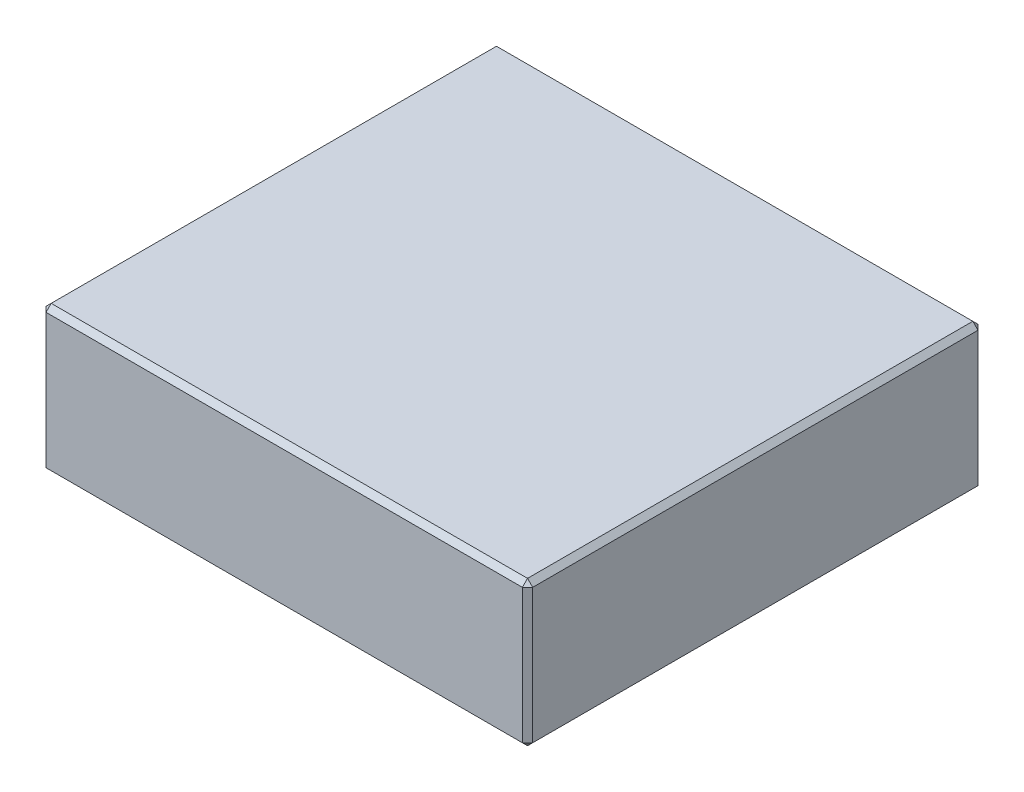
ISO-10303-21;
HEADER;
FILE_DESCRIPTION(('STEP AP214'),'2;1');
FILE_NAME('part.step','',(''),(''),'','','');
FILE_SCHEMA(('AUTOMOTIVE_DESIGN { 1 0 10303 214 1 1 1 1 }'));
ENDSEC;
DATA;
#1=APPLICATION_CONTEXT('core data for automotive mechanical design processes');
#2=APPLICATION_PROTOCOL_DEFINITION('international standard','automotive_design',2000,#1);
#3=PRODUCT_CONTEXT('',#1,'mechanical');
#4=PRODUCT('Part','Part','',(#3));
#5=PRODUCT_RELATED_PRODUCT_CATEGORY('part','',(#4));
#6=PRODUCT_DEFINITION_FORMATION('','',#4);
#7=PRODUCT_DEFINITION_CONTEXT('part definition',#1,'design');
#8=PRODUCT_DEFINITION('design','',#6,#7);
#9=PRODUCT_DEFINITION_SHAPE('','',#8);
#10=(LENGTH_UNIT() NAMED_UNIT(*) SI_UNIT(.MILLI.,.METRE.));
#11=(NAMED_UNIT(*) PLANE_ANGLE_UNIT() SI_UNIT($,.RADIAN.));
#12=(NAMED_UNIT(*) SI_UNIT($,.STERADIAN.) SOLID_ANGLE_UNIT());
#13=UNCERTAINTY_MEASURE_WITH_UNIT(LENGTH_MEASURE(1.E-05),#10,'distance_accuracy_value','');
#14=(GEOMETRIC_REPRESENTATION_CONTEXT(3) GLOBAL_UNCERTAINTY_ASSIGNED_CONTEXT((#13)) GLOBAL_UNIT_ASSIGNED_CONTEXT((#10,
#11,#12)) REPRESENTATION_CONTEXT('',''));
#15=CARTESIAN_POINT('',(0.,0.,0.));
#16=DIRECTION('',(0.,0.,1.));
#17=DIRECTION('',(1.,0.,0.));
#18=AXIS2_PLACEMENT_3D('',#15,#16,#17);
#19=CARTESIAN_POINT('',(23.5,14.,-22.));
#20=DIRECTION('',(-1.,0.,0.));
#21=DIRECTION('',(0.,0.,1.));
#22=AXIS2_PLACEMENT_3D('',#19,#20,#21);
#23=PLANE('',#22);
#24=DIRECTION('',(0.,0.,-1.));
#25=VECTOR('',#24,1.);
#26=CARTESIAN_POINT('',(23.5,0.5,-22.));
#27=LINE('',#26,#25);
#28=CARTESIAN_POINT('',(23.5,0.5,21.5));
#29=VERTEX_POINT('',#28);
#30=CARTESIAN_POINT('',(23.5,0.5,-21.5));
#31=VERTEX_POINT('',#30);
#32=EDGE_CURVE('E169',#29,#31,#27,.T.);
#33=ORIENTED_EDGE('',*,*,#32,.T.);
#34=DIRECTION('',(0.,1.,0.));
#35=VECTOR('',#34,1.);
#36=CARTESIAN_POINT('',(23.5,14.,-21.5));
#37=LINE('',#36,#35);
#38=CARTESIAN_POINT('',(23.5,13.5,-21.5));
#39=VERTEX_POINT('',#38);
#40=EDGE_CURVE('E174',#31,#39,#37,.T.);
#41=ORIENTED_EDGE('',*,*,#40,.T.);
#42=DIRECTION('',(0.,0.,1.));
#43=VECTOR('',#42,1.);
#44=CARTESIAN_POINT('',(23.5,13.5,22.));
#45=LINE('',#44,#43);
#46=CARTESIAN_POINT('',(23.5,13.5,21.5));
#47=VERTEX_POINT('',#46);
#48=EDGE_CURVE('E171',#39,#47,#45,.T.);
#49=ORIENTED_EDGE('',*,*,#48,.T.);
#50=DIRECTION('',(0.,-1.,0.));
#51=VECTOR('',#50,1.);
#52=CARTESIAN_POINT('',(23.5,14.,21.5));
#53=LINE('',#52,#51);
#54=EDGE_CURVE('E167',#47,#29,#53,.T.);
#55=ORIENTED_EDGE('',*,*,#54,.T.);
#56=EDGE_LOOP('',(#33,#41,#49,#55));
#57=FACE_BOUND('',#56,.T.);
#58=ADVANCED_FACE('F33',(#57),#23,.F.);
#59=CARTESIAN_POINT('',(-23.5,14.,-22.));
#60=DIRECTION('',(0.,0.,1.));
#61=DIRECTION('',(1.,0.,0.));
#62=AXIS2_PLACEMENT_3D('',#59,#60,#61);
#63=PLANE('',#62);
#64=DIRECTION('',(0.,-1.,0.));
#65=VECTOR('',#64,1.);
#66=CARTESIAN_POINT('',(23.,14.,-22.));
#67=LINE('',#66,#65);
#68=CARTESIAN_POINT('',(23.,13.5,-22.));
#69=VERTEX_POINT('',#68);
#70=CARTESIAN_POINT('',(23.,0.5,-22.));
#71=VERTEX_POINT('',#70);
#72=EDGE_CURVE('E56',#69,#71,#67,.T.);
#73=ORIENTED_EDGE('',*,*,#72,.T.);
#74=DIRECTION('',(-1.,0.,0.));
#75=VECTOR('',#74,1.);
#76=CARTESIAN_POINT('',(-23.5,0.5,-22.));
#77=LINE('',#76,#75);
#78=CARTESIAN_POINT('',(-23.,0.5,-22.));
#79=VERTEX_POINT('',#78);
#80=EDGE_CURVE('E11',#71,#79,#77,.T.);
#81=ORIENTED_EDGE('',*,*,#80,.T.);
#82=DIRECTION('',(0.,1.,0.));
#83=VECTOR('',#82,1.);
#84=CARTESIAN_POINT('',(-23.,14.,-22.));
#85=LINE('',#84,#83);
#86=CARTESIAN_POINT('',(-23.,13.5,-22.));
#87=VERTEX_POINT('',#86);
#88=EDGE_CURVE('E42',#79,#87,#85,.T.);
#89=ORIENTED_EDGE('',*,*,#88,.T.);
#90=DIRECTION('',(1.,0.,0.));
#91=VECTOR('',#90,1.);
#92=CARTESIAN_POINT('',(23.5,13.5,-22.));
#93=LINE('',#92,#91);
#94=EDGE_CURVE('E202',#87,#69,#93,.T.);
#95=ORIENTED_EDGE('',*,*,#94,.T.);
#96=EDGE_LOOP('',(#73,#81,#89,#95));
#97=FACE_BOUND('',#96,.T.);
#98=ADVANCED_FACE('F272',(#97),#63,.F.);
#99=CARTESIAN_POINT('',(-23.5,14.,-22.));
#100=DIRECTION('',(1.,0.,0.));
#101=DIRECTION('',(0.,0.,-1.));
#102=AXIS2_PLACEMENT_3D('',#99,#100,#101);
#103=PLANE('',#102);
#104=DIRECTION('',(0.,-1.,0.));
#105=VECTOR('',#104,1.);
#106=CARTESIAN_POINT('',(-23.5,14.,-21.5));
#107=LINE('',#106,#105);
#108=CARTESIAN_POINT('',(-23.5,13.5,-21.5));
#109=VERTEX_POINT('',#108);
#110=CARTESIAN_POINT('',(-23.5,0.5,-21.5));
#111=VERTEX_POINT('',#110);
#112=EDGE_CURVE('E179',#109,#111,#107,.T.);
#113=ORIENTED_EDGE('',*,*,#112,.T.);
#114=DIRECTION('',(0.,0.,1.));
#115=VECTOR('',#114,1.);
#116=CARTESIAN_POINT('',(-23.5,0.5,-22.));
#117=LINE('',#116,#115);
#118=CARTESIAN_POINT('',(-23.5,0.5,21.5));
#119=VERTEX_POINT('',#118);
#120=EDGE_CURVE('E181',#111,#119,#117,.T.);
#121=ORIENTED_EDGE('',*,*,#120,.T.);
#122=DIRECTION('',(0.,1.,0.));
#123=VECTOR('',#122,1.);
#124=CARTESIAN_POINT('',(-23.5,14.,21.5));
#125=LINE('',#124,#123);
#126=CARTESIAN_POINT('',(-23.5,13.5,21.5));
#127=VERTEX_POINT('',#126);
#128=EDGE_CURVE('E177',#119,#127,#125,.T.);
#129=ORIENTED_EDGE('',*,*,#128,.T.);
#130=DIRECTION('',(0.,0.,-1.));
#131=VECTOR('',#130,1.);
#132=CARTESIAN_POINT('',(-23.5,13.5,-22.));
#133=LINE('',#132,#131);
#134=EDGE_CURVE('E141',#127,#109,#133,.T.);
#135=ORIENTED_EDGE('',*,*,#134,.T.);
#136=EDGE_LOOP('',(#113,#121,#129,#135));
#137=FACE_BOUND('',#136,.T.);
#138=ADVANCED_FACE('F310',(#137),#103,.F.);
#139=CARTESIAN_POINT('',(-23.5,14.,22.));
#140=DIRECTION('',(0.,0.,-1.));
#141=DIRECTION('',(-1.,0.,0.));
#142=AXIS2_PLACEMENT_3D('',#139,#140,#141);
#143=PLANE('',#142);
#144=DIRECTION('',(0.,-1.,0.));
#145=VECTOR('',#144,1.);
#146=CARTESIAN_POINT('',(-23.,14.,22.));
#147=LINE('',#146,#145);
#148=CARTESIAN_POINT('',(-23.,13.5,22.));
#149=VERTEX_POINT('',#148);
#150=CARTESIAN_POINT('',(-23.,0.500000000000014,22.));
#151=VERTEX_POINT('',#150);
#152=EDGE_CURVE('E197',#149,#151,#147,.T.);
#153=ORIENTED_EDGE('',*,*,#152,.T.);
#154=DIRECTION('',(1.,0.,0.));
#155=VECTOR('',#154,1.);
#156=CARTESIAN_POINT('',(-23.5,0.500000000000014,22.));
#157=LINE('',#156,#155);
#158=CARTESIAN_POINT('',(23.,0.500000000000014,22.));
#159=VERTEX_POINT('',#158);
#160=EDGE_CURVE('E199',#151,#159,#157,.T.);
#161=ORIENTED_EDGE('',*,*,#160,.T.);
#162=DIRECTION('',(0.,1.,0.));
#163=VECTOR('',#162,1.);
#164=CARTESIAN_POINT('',(23.,14.,22.));
#165=LINE('',#164,#163);
#166=CARTESIAN_POINT('',(23.,13.5,22.));
#167=VERTEX_POINT('',#166);
#168=EDGE_CURVE('E195',#159,#167,#165,.T.);
#169=ORIENTED_EDGE('',*,*,#168,.T.);
#170=DIRECTION('',(-1.,0.,0.));
#171=VECTOR('',#170,1.);
#172=CARTESIAN_POINT('',(-23.5,13.5,22.));
#173=LINE('',#172,#171);
#174=EDGE_CURVE('E193',#167,#149,#173,.T.);
#175=ORIENTED_EDGE('',*,*,#174,.T.);
#176=EDGE_LOOP('',(#153,#161,#169,#175));
#177=FACE_BOUND('',#176,.T.);
#178=ADVANCED_FACE('F301',(#177),#143,.F.);
#179=CARTESIAN_POINT('',(0.,14.,0.));
#180=DIRECTION('',(0.,1.,0.));
#181=DIRECTION('',(0.,0.,1.));
#182=AXIS2_PLACEMENT_3D('',#179,#180,#181);
#183=PLANE('',#182);
#184=DIRECTION('',(1.,0.,0.));
#185=VECTOR('',#184,1.);
#186=CARTESIAN_POINT('',(23.5,14.,21.5));
#187=LINE('',#186,#185);
#188=CARTESIAN_POINT('',(-23.,14.,21.5));
#189=VERTEX_POINT('',#188);
#190=CARTESIAN_POINT('',(23.,14.,21.5));
#191=VERTEX_POINT('',#190);
#192=EDGE_CURVE('E128',#189,#191,#187,.T.);
#193=ORIENTED_EDGE('',*,*,#192,.T.);
#194=DIRECTION('',(0.,0.,-1.));
#195=VECTOR('',#194,1.);
#196=CARTESIAN_POINT('',(23.,14.,-22.));
#197=LINE('',#196,#195);
#198=CARTESIAN_POINT('',(23.,14.,-21.5));
#199=VERTEX_POINT('',#198);
#200=EDGE_CURVE('E165',#191,#199,#197,.T.);
#201=ORIENTED_EDGE('',*,*,#200,.T.);
#202=DIRECTION('',(-1.,0.,0.));
#203=VECTOR('',#202,1.);
#204=CARTESIAN_POINT('',(-23.5,14.,-21.5));
#205=LINE('',#204,#203);
#206=CARTESIAN_POINT('',(-23.,14.,-21.5));
#207=VERTEX_POINT('',#206);
#208=EDGE_CURVE('E131',#199,#207,#205,.T.);
#209=ORIENTED_EDGE('',*,*,#208,.T.);
#210=DIRECTION('',(0.,0.,1.));
#211=VECTOR('',#210,1.);
#212=CARTESIAN_POINT('',(-23.,14.,22.));
#213=LINE('',#212,#211);
#214=EDGE_CURVE('E123',#207,#189,#213,.T.);
#215=ORIENTED_EDGE('',*,*,#214,.T.);
#216=EDGE_LOOP('',(#193,#201,#209,#215));
#217=FACE_BOUND('',#216,.T.);
#218=ADVANCED_FACE('F125',(#217),#183,.T.);
#219=CARTESIAN_POINT('',(0.,0.,0.));
#220=DIRECTION('',(0.,1.,0.));
#221=DIRECTION('',(0.,0.,1.));
#222=AXIS2_PLACEMENT_3D('',#219,#220,#221);
#223=PLANE('',#222);
#224=DIRECTION('',(-1.,0.,0.));
#225=VECTOR('',#224,1.);
#226=CARTESIAN_POINT('',(0.,0.,21.5));
#227=LINE('',#226,#225);
#228=CARTESIAN_POINT('',(23.,0.,21.5));
#229=VERTEX_POINT('',#228);
#230=CARTESIAN_POINT('',(-23.,0.,21.5));
#231=VERTEX_POINT('',#230);
#232=EDGE_CURVE('E188',#229,#231,#227,.T.);
#233=ORIENTED_EDGE('',*,*,#232,.T.);
#234=DIRECTION('',(0.,0.,-1.));
#235=VECTOR('',#234,1.);
#236=CARTESIAN_POINT('',(-23.,0.,0.));
#237=LINE('',#236,#235);
#238=CARTESIAN_POINT('',(-23.,0.,-21.5));
#239=VERTEX_POINT('',#238);
#240=EDGE_CURVE('E190',#231,#239,#237,.T.);
#241=ORIENTED_EDGE('',*,*,#240,.T.);
#242=DIRECTION('',(1.,0.,0.));
#243=VECTOR('',#242,1.);
#244=CARTESIAN_POINT('',(0.,0.,-21.5));
#245=LINE('',#244,#243);
#246=CARTESIAN_POINT('',(23.,0.,-21.5));
#247=VERTEX_POINT('',#246);
#248=EDGE_CURVE('E184',#239,#247,#245,.T.);
#249=ORIENTED_EDGE('',*,*,#248,.T.);
#250=DIRECTION('',(0.,0.,1.));
#251=VECTOR('',#250,1.);
#252=CARTESIAN_POINT('',(23.,0.,0.));
#253=LINE('',#252,#251);
#254=EDGE_CURVE('E186',#247,#229,#253,.T.);
#255=ORIENTED_EDGE('',*,*,#254,.T.);
#256=EDGE_LOOP('',(#233,#241,#249,#255));
#257=FACE_BOUND('',#256,.T.);
#258=ADVANCED_FACE('F287',(#257),#223,.F.);
#259=CARTESIAN_POINT('',(-23.5,0.5,-22.));
#260=DIRECTION('',(0.707106781186538,0.707106781186557,0.));
#261=DIRECTION('',(0.,0.,1.));
#262=AXIS2_PLACEMENT_3D('',#259,#260,#261);
#263=PLANE('',#262);
#264=DIRECTION('',(-0.707106781186557,0.707106781186538,0.));
#265=VECTOR('',#264,1.);
#266=CARTESIAN_POINT('',(-23.5,0.5,21.5));
#267=LINE('',#266,#265);
#268=EDGE_CURVE('E37',#119,#231,#267,.F.);
#269=ORIENTED_EDGE('',*,*,#268,.F.);
#270=ORIENTED_EDGE('',*,*,#120,.F.);
#271=DIRECTION('',(0.707106781186557,-0.707106781186538,0.));
#272=VECTOR('',#271,1.);
#273=CARTESIAN_POINT('',(-23.,0.,-21.5));
#274=LINE('',#273,#272);
#275=EDGE_CURVE('E162',#239,#111,#274,.F.);
#276=ORIENTED_EDGE('',*,*,#275,.F.);
#277=ORIENTED_EDGE('',*,*,#240,.F.);
#278=EDGE_LOOP('',(#269,#270,#276,#277));
#279=FACE_BOUND('',#278,.T.);
#280=ADVANCED_FACE('F35',(#279),#263,.F.);
#281=CARTESIAN_POINT('',(-23.5,0.5,21.5));
#282=DIRECTION('',(-0.57735026918961,-0.577350269189626,0.577350269189642));
#283=DIRECTION('',(0.,-0.707106781186557,-0.707106781186538));
#284=AXIS2_PLACEMENT_3D('',#281,#282,#283);
#285=PLANE('',#284);
#286=DIRECTION('',(0.707106781186557,0.,0.707106781186538));
#287=VECTOR('',#286,1.);
#288=CARTESIAN_POINT('',(-23.5,0.5,21.5));
#289=LINE('',#288,#287);
#290=EDGE_CURVE('E249',#119,#151,#289,.T.);
#291=ORIENTED_EDGE('',*,*,#290,.F.);
#292=ORIENTED_EDGE('',*,*,#268,.T.);
#293=DIRECTION('',(0.,-0.707106781186557,-0.707106781186538));
#294=VECTOR('',#293,1.);
#295=CARTESIAN_POINT('',(-23.,0.250000000000007,21.75));
#296=LINE('',#295,#294);
#297=EDGE_CURVE('E252',#151,#231,#296,.T.);
#298=ORIENTED_EDGE('',*,*,#297,.F.);
#299=EDGE_LOOP('',(#291,#292,#298));
#300=FACE_BOUND('',#299,.T.);
#301=ADVANCED_FACE('F309',(#300),#285,.T.);
#302=CARTESIAN_POINT('',(-23.,0.,-21.5));
#303=DIRECTION('',(-0.57735026918961,-0.577350269189642,-0.577350269189626));
#304=DIRECTION('',(0.,0.707106781186538,-0.707106781186557));
#305=AXIS2_PLACEMENT_3D('',#302,#303,#304);
#306=PLANE('',#305);
#307=DIRECTION('',(0.,0.707106781186538,-0.707106781186557));
#308=VECTOR('',#307,1.);
#309=CARTESIAN_POINT('',(-23.,0.,-21.5));
#310=LINE('',#309,#308);
#311=EDGE_CURVE('E244',#239,#79,#310,.T.);
#312=ORIENTED_EDGE('',*,*,#311,.F.);
#313=ORIENTED_EDGE('',*,*,#275,.T.);
#314=DIRECTION('',(-0.707106781186557,0.,0.707106781186538));
#315=VECTOR('',#314,1.);
#316=CARTESIAN_POINT('',(-23.25,0.500000000000001,-21.75));
#317=LINE('',#316,#315);
#318=EDGE_CURVE('E247',#79,#111,#317,.T.);
#319=ORIENTED_EDGE('',*,*,#318,.F.);
#320=EDGE_LOOP('',(#312,#313,#319));
#321=FACE_BOUND('',#320,.T.);
#322=ADVANCED_FACE('F258',(#321),#306,.T.);
#323=CARTESIAN_POINT('',(-23.5,0.500000000000014,22.));
#324=DIRECTION('',(0.,0.707106781186538,-0.707106781186557));
#325=DIRECTION('',(1.,0.,0.));
#326=AXIS2_PLACEMENT_3D('',#323,#324,#325);
#327=PLANE('',#326);
#328=ORIENTED_EDGE('',*,*,#297,.T.);
#329=ORIENTED_EDGE('',*,*,#232,.F.);
#330=DIRECTION('',(0.,0.707106781186557,0.707106781186538));
#331=VECTOR('',#330,1.);
#332=CARTESIAN_POINT('',(23.,0.500000000000014,22.));
#333=LINE('',#332,#331);
#334=EDGE_CURVE('E238',#159,#229,#333,.F.);
#335=ORIENTED_EDGE('',*,*,#334,.F.);
#336=ORIENTED_EDGE('',*,*,#160,.F.);
#337=EDGE_LOOP('',(#328,#329,#335,#336));
#338=FACE_BOUND('',#337,.T.);
#339=ADVANCED_FACE('F299',(#338),#327,.F.);
#340=CARTESIAN_POINT('',(-23.,14.,22.));
#341=DIRECTION('',(0.707106781186538,0.,-0.707106781186557));
#342=DIRECTION('',(0.,-1.,0.));
#343=AXIS2_PLACEMENT_3D('',#340,#341,#342);
#344=PLANE('',#343);
#345=ORIENTED_EDGE('',*,*,#290,.T.);
#346=ORIENTED_EDGE('',*,*,#152,.F.);
#347=DIRECTION('',(-0.707106781186557,0.,-0.707106781186538));
#348=VECTOR('',#347,1.);
#349=CARTESIAN_POINT('',(-23.5,13.5,21.5));
#350=LINE('',#349,#348);
#351=EDGE_CURVE('E145',#127,#149,#350,.F.);
#352=ORIENTED_EDGE('',*,*,#351,.F.);
#353=ORIENTED_EDGE('',*,*,#128,.F.);
#354=EDGE_LOOP('',(#345,#346,#352,#353));
#355=FACE_BOUND('',#354,.T.);
#356=ADVANCED_FACE('F306',(#355),#344,.F.);
#357=CARTESIAN_POINT('',(-23.,14.,0.));
#358=DIRECTION('',(-0.707106781186557,0.707106781186538,0.));
#359=DIRECTION('',(0.,0.,-1.));
#360=AXIS2_PLACEMENT_3D('',#357,#358,#359);
#361=PLANE('',#360);
#362=DIRECTION('',(0.707106781186538,0.707106781186557,0.));
#363=VECTOR('',#362,1.);
#364=CARTESIAN_POINT('',(-23.25,13.75,-21.5));
#365=LINE('',#364,#363);
#366=EDGE_CURVE('E146',#109,#207,#365,.T.);
#367=ORIENTED_EDGE('',*,*,#366,.F.);
#368=ORIENTED_EDGE('',*,*,#134,.F.);
#369=DIRECTION('',(-0.707106781186538,-0.707106781186557,0.));
#370=VECTOR('',#369,1.);
#371=CARTESIAN_POINT('',(-23.5,13.5,21.5));
#372=LINE('',#371,#370);
#373=EDGE_CURVE('E138',#189,#127,#372,.T.);
#374=ORIENTED_EDGE('',*,*,#373,.F.);
#375=ORIENTED_EDGE('',*,*,#214,.F.);
#376=EDGE_LOOP('',(#367,#368,#374,#375));
#377=FACE_BOUND('',#376,.T.);
#378=ADVANCED_FACE('F140',(#377),#361,.T.);
#379=CARTESIAN_POINT('',(-23.5,14.,-21.5));
#380=DIRECTION('',(0.707106781186538,0.,0.707106781186557));
#381=DIRECTION('',(0.,-1.,0.));
#382=AXIS2_PLACEMENT_3D('',#379,#380,#381);
#383=PLANE('',#382);
#384=ORIENTED_EDGE('',*,*,#318,.T.);
#385=ORIENTED_EDGE('',*,*,#112,.F.);
#386=DIRECTION('',(0.707106781186557,0.,-0.707106781186538));
#387=VECTOR('',#386,1.);
#388=CARTESIAN_POINT('',(-23.,13.5,-22.));
#389=LINE('',#388,#387);
#390=EDGE_CURVE('E233',#87,#109,#389,.F.);
#391=ORIENTED_EDGE('',*,*,#390,.F.);
#392=ORIENTED_EDGE('',*,*,#88,.F.);
#393=EDGE_LOOP('',(#384,#385,#391,#392));
#394=FACE_BOUND('',#393,.T.);
#395=ADVANCED_FACE('F263',(#394),#383,.F.);
#396=CARTESIAN_POINT('',(-23.5,0.5,-22.));
#397=DIRECTION('',(0.,0.707106781186557,0.707106781186538));
#398=DIRECTION('',(-1.,0.,0.));
#399=AXIS2_PLACEMENT_3D('',#396,#397,#398);
#400=PLANE('',#399);
#401=ORIENTED_EDGE('',*,*,#311,.T.);
#402=ORIENTED_EDGE('',*,*,#80,.F.);
#403=DIRECTION('',(0.,-0.707106781186538,0.707106781186557));
#404=VECTOR('',#403,1.);
#405=CARTESIAN_POINT('',(23.,0.25,-21.75));
#406=LINE('',#405,#404);
#407=EDGE_CURVE('E230',#247,#71,#406,.F.);
#408=ORIENTED_EDGE('',*,*,#407,.F.);
#409=ORIENTED_EDGE('',*,*,#248,.F.);
#410=EDGE_LOOP('',(#401,#402,#408,#409));
#411=FACE_BOUND('',#410,.T.);
#412=ADVANCED_FACE('F284',(#411),#400,.F.);
#413=CARTESIAN_POINT('',(23.5,0.5,-22.));
#414=DIRECTION('',(-0.707106781186538,0.707106781186557,0.));
#415=DIRECTION('',(0.,0.,-1.));
#416=AXIS2_PLACEMENT_3D('',#413,#414,#415);
#417=PLANE('',#416);
#418=DIRECTION('',(-0.707106781186557,-0.707106781186538,0.));
#419=VECTOR('',#418,1.);
#420=CARTESIAN_POINT('',(23.25,0.25,21.5));
#421=LINE('',#420,#419);
#422=EDGE_CURVE('E241',#229,#29,#421,.F.);
#423=ORIENTED_EDGE('',*,*,#422,.F.);
#424=ORIENTED_EDGE('',*,*,#254,.F.);
#425=DIRECTION('',(0.707106781186557,0.707106781186538,0.));
#426=VECTOR('',#425,1.);
#427=CARTESIAN_POINT('',(23.5,0.5,-21.5));
#428=LINE('',#427,#426);
#429=EDGE_CURVE('E227',#31,#247,#428,.F.);
#430=ORIENTED_EDGE('',*,*,#429,.F.);
#431=ORIENTED_EDGE('',*,*,#32,.F.);
#432=EDGE_LOOP('',(#423,#424,#430,#431));
#433=FACE_BOUND('',#432,.T.);
#434=ADVANCED_FACE('F291',(#433),#417,.F.);
#435=CARTESIAN_POINT('',(23.,0.500000000000014,22.));
#436=DIRECTION('',(0.57735026918961,-0.577350269189626,0.577350269189642));
#437=DIRECTION('',(0.,-0.707106781186557,-0.707106781186538));
#438=AXIS2_PLACEMENT_3D('',#435,#436,#437);
#439=PLANE('',#438);
#440=ORIENTED_EDGE('',*,*,#334,.T.);
#441=ORIENTED_EDGE('',*,*,#422,.T.);
#442=DIRECTION('',(0.707106781186557,0.,-0.707106781186538));
#443=VECTOR('',#442,1.);
#444=CARTESIAN_POINT('',(23.,0.500000000000014,22.));
#445=LINE('',#444,#443);
#446=EDGE_CURVE('E153',#159,#29,#445,.T.);
#447=ORIENTED_EDGE('',*,*,#446,.F.);
#448=EDGE_LOOP('',(#440,#441,#447));
#449=FACE_BOUND('',#448,.T.);
#450=ADVANCED_FACE('F296',(#449),#439,.T.);
#451=CARTESIAN_POINT('',(-23.5,13.5,21.5));
#452=DIRECTION('',(-0.577350269189626,0.57735026918961,0.577350269189642));
#453=DIRECTION('',(0.707106781186557,0.,0.707106781186538));
#454=AXIS2_PLACEMENT_3D('',#451,#452,#453);
#455=PLANE('',#454);
#456=ORIENTED_EDGE('',*,*,#373,.T.);
#457=ORIENTED_EDGE('',*,*,#351,.T.);
#458=DIRECTION('',(0.,0.707106781186557,-0.707106781186538));
#459=VECTOR('',#458,1.);
#460=CARTESIAN_POINT('',(-23.,13.75,21.75));
#461=LINE('',#460,#459);
#462=EDGE_CURVE('E149',#189,#149,#461,.F.);
#463=ORIENTED_EDGE('',*,*,#462,.F.);
#464=EDGE_LOOP('',(#456,#457,#463));
#465=FACE_BOUND('',#464,.T.);
#466=ADVANCED_FACE('F150',(#465),#455,.T.);
#467=CARTESIAN_POINT('',(-23.,13.5,-22.));
#468=DIRECTION('',(-0.577350269189626,0.57735026918961,-0.577350269189642));
#469=DIRECTION('',(-0.707106781186557,0.,0.707106781186538));
#470=AXIS2_PLACEMENT_3D('',#467,#468,#469);
#471=PLANE('',#470);
#472=ORIENTED_EDGE('',*,*,#390,.T.);
#473=ORIENTED_EDGE('',*,*,#366,.T.);
#474=DIRECTION('',(0.,-0.707106781186557,-0.707106781186538));
#475=VECTOR('',#474,1.);
#476=CARTESIAN_POINT('',(-23.,13.5,-22.));
#477=LINE('',#476,#475);
#478=EDGE_CURVE('E154',#87,#207,#477,.F.);
#479=ORIENTED_EDGE('',*,*,#478,.F.);
#480=EDGE_LOOP('',(#472,#473,#479));
#481=FACE_BOUND('',#480,.T.);
#482=ADVANCED_FACE('F267',(#481),#471,.T.);
#483=CARTESIAN_POINT('',(23.5,0.5,-21.5));
#484=DIRECTION('',(0.577350269189626,-0.577350269189642,-0.57735026918961));
#485=DIRECTION('',(0.707106781186557,0.707106781186538,0.));
#486=AXIS2_PLACEMENT_3D('',#483,#484,#485);
#487=PLANE('',#486);
#488=ORIENTED_EDGE('',*,*,#429,.T.);
#489=ORIENTED_EDGE('',*,*,#407,.T.);
#490=DIRECTION('',(-0.707106781186538,0.,-0.707106781186557));
#491=VECTOR('',#490,1.);
#492=CARTESIAN_POINT('',(23.5,0.5,-21.5));
#493=LINE('',#492,#491);
#494=EDGE_CURVE('E220',#31,#71,#493,.T.);
#495=ORIENTED_EDGE('',*,*,#494,.F.);
#496=EDGE_LOOP('',(#488,#489,#495));
#497=FACE_BOUND('',#496,.T.);
#498=ADVANCED_FACE('F280',(#497),#487,.T.);
#499=CARTESIAN_POINT('',(23.5,14.,21.5));
#500=DIRECTION('',(-0.707106781186538,0.,-0.707106781186557));
#501=DIRECTION('',(0.,-1.,0.));
#502=AXIS2_PLACEMENT_3D('',#499,#500,#501);
#503=PLANE('',#502);
#504=ORIENTED_EDGE('',*,*,#446,.T.);
#505=ORIENTED_EDGE('',*,*,#54,.F.);
#506=DIRECTION('',(-0.707106781186557,0.,0.707106781186538));
#507=VECTOR('',#506,1.);
#508=CARTESIAN_POINT('',(23.5,13.5,21.5));
#509=LINE('',#508,#507);
#510=EDGE_CURVE('E217',#167,#47,#509,.F.);
#511=ORIENTED_EDGE('',*,*,#510,.F.);
#512=ORIENTED_EDGE('',*,*,#168,.F.);
#513=EDGE_LOOP('',(#504,#505,#511,#512));
#514=FACE_BOUND('',#513,.T.);
#515=ADVANCED_FACE('F343',(#514),#503,.F.);
#516=CARTESIAN_POINT('',(0.,14.,21.5));
#517=DIRECTION('',(0.,0.707106781186538,0.707106781186557));
#518=DIRECTION('',(-1.,0.,0.));
#519=AXIS2_PLACEMENT_3D('',#516,#517,#518);
#520=PLANE('',#519);
#521=ORIENTED_EDGE('',*,*,#462,.T.);
#522=ORIENTED_EDGE('',*,*,#174,.F.);
#523=DIRECTION('',(0.,-0.707106781186557,0.707106781186538));
#524=VECTOR('',#523,1.);
#525=CARTESIAN_POINT('',(23.,13.75,21.75));
#526=LINE('',#525,#524);
#527=EDGE_CURVE('E158',#191,#167,#526,.T.);
#528=ORIENTED_EDGE('',*,*,#527,.F.);
#529=ORIENTED_EDGE('',*,*,#192,.F.);
#530=EDGE_LOOP('',(#521,#522,#528,#529));
#531=FACE_BOUND('',#530,.T.);
#532=ADVANCED_FACE('F156',(#531),#520,.T.);
#533=CARTESIAN_POINT('',(0.,14.,-21.5));
#534=DIRECTION('',(0.,0.707106781186538,-0.707106781186557));
#535=DIRECTION('',(1.,0.,0.));
#536=AXIS2_PLACEMENT_3D('',#533,#534,#535);
#537=PLANE('',#536);
#538=ORIENTED_EDGE('',*,*,#478,.T.);
#539=ORIENTED_EDGE('',*,*,#208,.F.);
#540=DIRECTION('',(0.,0.707106781186557,0.707106781186538));
#541=VECTOR('',#540,1.);
#542=CARTESIAN_POINT('',(23.,14.,-21.5));
#543=LINE('',#542,#541);
#544=EDGE_CURVE('E213',#69,#199,#543,.T.);
#545=ORIENTED_EDGE('',*,*,#544,.F.);
#546=ORIENTED_EDGE('',*,*,#94,.F.);
#547=EDGE_LOOP('',(#538,#539,#545,#546));
#548=FACE_BOUND('',#547,.T.);
#549=ADVANCED_FACE('F271',(#548),#537,.T.);
#550=CARTESIAN_POINT('',(23.,14.,-22.));
#551=DIRECTION('',(-0.707106781186557,0.,0.707106781186538));
#552=DIRECTION('',(0.,-1.,0.));
#553=AXIS2_PLACEMENT_3D('',#550,#551,#552);
#554=PLANE('',#553);
#555=ORIENTED_EDGE('',*,*,#494,.T.);
#556=ORIENTED_EDGE('',*,*,#72,.F.);
#557=DIRECTION('',(0.707106781186538,0.,0.707106781186557));
#558=VECTOR('',#557,1.);
#559=CARTESIAN_POINT('',(23.25,13.5,-21.75));
#560=LINE('',#559,#558);
#561=EDGE_CURVE('E210',#39,#69,#560,.F.);
#562=ORIENTED_EDGE('',*,*,#561,.F.);
#563=ORIENTED_EDGE('',*,*,#40,.F.);
#564=EDGE_LOOP('',(#555,#556,#562,#563));
#565=FACE_BOUND('',#564,.T.);
#566=ADVANCED_FACE('F275',(#565),#554,.F.);
#567=CARTESIAN_POINT('',(23.5,13.5,21.5));
#568=DIRECTION('',(0.577350269189626,0.57735026918961,0.577350269189642));
#569=DIRECTION('',(0.707106781186557,0.,-0.707106781186538));
#570=AXIS2_PLACEMENT_3D('',#567,#568,#569);
#571=PLANE('',#570);
#572=ORIENTED_EDGE('',*,*,#527,.T.);
#573=ORIENTED_EDGE('',*,*,#510,.T.);
#574=DIRECTION('',(-0.707106781186538,0.707106781186557,0.));
#575=VECTOR('',#574,1.);
#576=CARTESIAN_POINT('',(23.5,13.5,21.5));
#577=LINE('',#576,#575);
#578=EDGE_CURVE('E208',#191,#47,#577,.F.);
#579=ORIENTED_EDGE('',*,*,#578,.F.);
#580=EDGE_LOOP('',(#572,#573,#579));
#581=FACE_BOUND('',#580,.T.);
#582=ADVANCED_FACE('F332',(#581),#571,.T.);
#583=CARTESIAN_POINT('',(23.,14.,-21.5));
#584=DIRECTION('',(0.577350269189642,0.57735026918961,-0.577350269189626));
#585=DIRECTION('',(-0.707106781186538,0.,-0.707106781186557));
#586=AXIS2_PLACEMENT_3D('',#583,#584,#585);
#587=PLANE('',#586);
#588=ORIENTED_EDGE('',*,*,#561,.T.);
#589=ORIENTED_EDGE('',*,*,#544,.T.);
#590=DIRECTION('',(0.707106781186538,-0.707106781186557,0.));
#591=VECTOR('',#590,1.);
#592=CARTESIAN_POINT('',(23.,14.,-21.5));
#593=LINE('',#592,#591);
#594=EDGE_CURVE('E206',#39,#199,#593,.F.);
#595=ORIENTED_EDGE('',*,*,#594,.F.);
#596=EDGE_LOOP('',(#588,#589,#595));
#597=FACE_BOUND('',#596,.T.);
#598=ADVANCED_FACE('F328',(#597),#587,.T.);
#599=CARTESIAN_POINT('',(23.,14.,0.));
#600=DIRECTION('',(0.707106781186557,0.707106781186538,0.));
#601=DIRECTION('',(0.,0.,1.));
#602=AXIS2_PLACEMENT_3D('',#599,#600,#601);
#603=PLANE('',#602);
#604=ORIENTED_EDGE('',*,*,#578,.T.);
#605=ORIENTED_EDGE('',*,*,#48,.F.);
#606=ORIENTED_EDGE('',*,*,#594,.T.);
#607=ORIENTED_EDGE('',*,*,#200,.F.);
#608=EDGE_LOOP('',(#604,#605,#606,#607));
#609=FACE_BOUND('',#608,.T.);
#610=ADVANCED_FACE('F325',(#609),#603,.T.);
#611=CLOSED_SHELL('',(#58,#98,#138,#178,#218,#258,#280,#301,#322,#339,#356,#378,#395,#412,#434,
#450,#466,#482,#498,#515,#532,#549,#566,#582,#598,#610));
#612=MANIFOLD_SOLID_BREP('B2',#611);
#613=ADVANCED_BREP_SHAPE_REPRESENTATION('',(#18,#612),#14);
#614=SHAPE_DEFINITION_REPRESENTATION(#9,#613);
ENDSEC;
END-ISO-10303-21;
